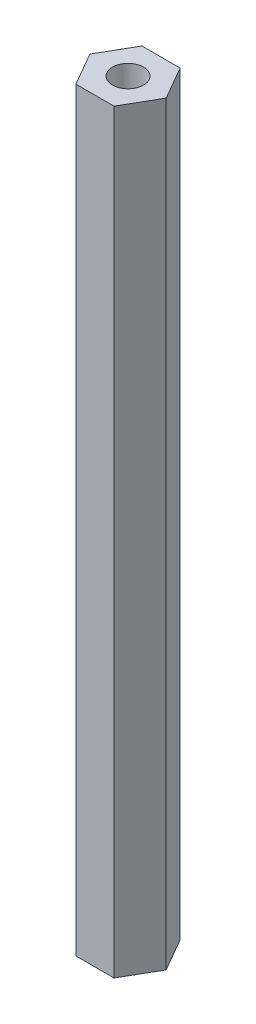
ISO-10303-21;
HEADER;
FILE_DESCRIPTION(('STEP AP214'),'2;1');
FILE_NAME('part.step','',(''),(''),'','','');
FILE_SCHEMA(('AUTOMOTIVE_DESIGN { 1 0 10303 214 1 1 1 1 }'));
ENDSEC;
DATA;
#1=APPLICATION_CONTEXT('core data for automotive mechanical design processes');
#2=APPLICATION_PROTOCOL_DEFINITION('international standard','automotive_design',2000,#1);
#3=PRODUCT_CONTEXT('',#1,'mechanical');
#4=PRODUCT('Part','Part','',(#3));
#5=PRODUCT_RELATED_PRODUCT_CATEGORY('part','',(#4));
#6=PRODUCT_DEFINITION_FORMATION('','',#4);
#7=PRODUCT_DEFINITION_CONTEXT('part definition',#1,'design');
#8=PRODUCT_DEFINITION('design','',#6,#7);
#9=PRODUCT_DEFINITION_SHAPE('','',#8);
#10=(LENGTH_UNIT() NAMED_UNIT(*) SI_UNIT(.MILLI.,.METRE.));
#11=(NAMED_UNIT(*) PLANE_ANGLE_UNIT() SI_UNIT($,.RADIAN.));
#12=(NAMED_UNIT(*) SI_UNIT($,.STERADIAN.) SOLID_ANGLE_UNIT());
#13=UNCERTAINTY_MEASURE_WITH_UNIT(LENGTH_MEASURE(1.E-05),#10,'distance_accuracy_value','');
#14=(GEOMETRIC_REPRESENTATION_CONTEXT(3) GLOBAL_UNCERTAINTY_ASSIGNED_CONTEXT((#13)) GLOBAL_UNIT_ASSIGNED_CONTEXT((#10,
#11,#12)) REPRESENTATION_CONTEXT('',''));
#15=CARTESIAN_POINT('',(0.,0.,0.));
#16=DIRECTION('',(0.,0.,1.));
#17=DIRECTION('',(1.,0.,0.));
#18=AXIS2_PLACEMENT_3D('',#15,#16,#17);
#19=CARTESIAN_POINT('',(2.02072594216368,40.,-3.50000000000001));
#20=DIRECTION('',(0.,0.,1.));
#21=DIRECTION('',(1.,0.,0.));
#22=AXIS2_PLACEMENT_3D('',#19,#20,#21);
#23=PLANE('',#22);
#24=DIRECTION('',(-1.,0.,0.));
#25=VECTOR('',#24,1.);
#26=CARTESIAN_POINT('',(2.02072594216368,-40.,-3.50000000000001));
#27=LINE('',#26,#25);
#28=CARTESIAN_POINT('',(2.02072594216368,-40.,-3.50000000000001));
#29=VERTEX_POINT('',#28);
#30=CARTESIAN_POINT('',(-2.0207259421637,-40.,-3.50000000000001));
#31=VERTEX_POINT('',#30);
#32=EDGE_CURVE('E144',#29,#31,#27,.T.);
#33=ORIENTED_EDGE('',*,*,#32,.T.);
#34=DIRECTION('',(0.,-1.,0.));
#35=VECTOR('',#34,1.);
#36=CARTESIAN_POINT('',(-2.0207259421637,40.,-3.50000000000001));
#37=LINE('',#36,#35);
#38=CARTESIAN_POINT('',(-2.0207259421637,40.,-3.50000000000001));
#39=VERTEX_POINT('',#38);
#40=EDGE_CURVE('E11',#39,#31,#37,.T.);
#41=ORIENTED_EDGE('',*,*,#40,.F.);
#42=DIRECTION('',(-1.,0.,0.));
#43=VECTOR('',#42,1.);
#44=CARTESIAN_POINT('',(2.02072594216368,40.,-3.50000000000001));
#45=LINE('',#44,#43);
#46=CARTESIAN_POINT('',(2.02072594216368,40.,-3.50000000000001));
#47=VERTEX_POINT('',#46);
#48=EDGE_CURVE('E165',#47,#39,#45,.T.);
#49=ORIENTED_EDGE('',*,*,#48,.F.);
#50=DIRECTION('',(0.,-1.,0.));
#51=VECTOR('',#50,1.);
#52=CARTESIAN_POINT('',(2.02072594216368,40.,-3.50000000000001));
#53=LINE('',#52,#51);
#54=EDGE_CURVE('E143',#47,#29,#53,.T.);
#55=ORIENTED_EDGE('',*,*,#54,.T.);
#56=EDGE_LOOP('',(#33,#41,#49,#55));
#57=FACE_BOUND('',#56,.T.);
#58=ADVANCED_FACE('F52',(#57),#23,.F.);
#59=CARTESIAN_POINT('',(-2.0207259421637,40.,-3.50000000000001));
#60=DIRECTION('',(0.866025403784439,0.,0.499999999999999));
#61=DIRECTION('',(0.499999999999999,0.,-0.866025403784439));
#62=AXIS2_PLACEMENT_3D('',#59,#60,#61);
#63=PLANE('',#62);
#64=DIRECTION('',(-0.499999999999999,0.,0.866025403784439));
#65=VECTOR('',#64,1.);
#66=CARTESIAN_POINT('',(-2.0207259421637,-40.,-3.50000000000001));
#67=LINE('',#66,#65);
#68=CARTESIAN_POINT('',(-4.04145188432738,-40.,0.));
#69=VERTEX_POINT('',#68);
#70=EDGE_CURVE('E149',#31,#69,#67,.T.);
#71=ORIENTED_EDGE('',*,*,#70,.T.);
#72=DIRECTION('',(0.,-1.,0.));
#73=VECTOR('',#72,1.);
#74=CARTESIAN_POINT('',(-4.04145188432738,40.,0.));
#75=LINE('',#74,#73);
#76=CARTESIAN_POINT('',(-4.04145188432738,40.,0.));
#77=VERTEX_POINT('',#76);
#78=EDGE_CURVE('E65',#77,#69,#75,.T.);
#79=ORIENTED_EDGE('',*,*,#78,.F.);
#80=DIRECTION('',(-0.499999999999999,0.,0.866025403784439));
#81=VECTOR('',#80,1.);
#82=CARTESIAN_POINT('',(-2.0207259421637,40.,-3.50000000000001));
#83=LINE('',#82,#81);
#84=EDGE_CURVE('E107',#39,#77,#83,.T.);
#85=ORIENTED_EDGE('',*,*,#84,.F.);
#86=ORIENTED_EDGE('',*,*,#40,.T.);
#87=EDGE_LOOP('',(#71,#79,#85,#86));
#88=FACE_BOUND('',#87,.T.);
#89=ADVANCED_FACE('F195',(#88),#63,.F.);
#90=CARTESIAN_POINT('',(-4.04145188432738,40.,0.));
#91=DIRECTION('',(0.866025403784439,0.,-0.499999999999999));
#92=DIRECTION('',(-0.499999999999999,0.,-0.866025403784439));
#93=AXIS2_PLACEMENT_3D('',#90,#91,#92);
#94=PLANE('',#93);
#95=DIRECTION('',(0.499999999999999,0.,0.866025403784439));
#96=VECTOR('',#95,1.);
#97=CARTESIAN_POINT('',(-4.04145188432738,-40.,0.));
#98=LINE('',#97,#96);
#99=CARTESIAN_POINT('',(-2.0207259421637,-40.,3.49999999999998));
#100=VERTEX_POINT('',#99);
#101=EDGE_CURVE('E153',#69,#100,#98,.T.);
#102=ORIENTED_EDGE('',*,*,#101,.T.);
#103=DIRECTION('',(0.,-1.,0.));
#104=VECTOR('',#103,1.);
#105=CARTESIAN_POINT('',(-2.0207259421637,40.,3.49999999999998));
#106=LINE('',#105,#104);
#107=CARTESIAN_POINT('',(-2.0207259421637,40.,3.49999999999998));
#108=VERTEX_POINT('',#107);
#109=EDGE_CURVE('E131',#108,#100,#106,.T.);
#110=ORIENTED_EDGE('',*,*,#109,.F.);
#111=DIRECTION('',(0.499999999999999,0.,0.866025403784439));
#112=VECTOR('',#111,1.);
#113=CARTESIAN_POINT('',(-4.04145188432738,40.,0.));
#114=LINE('',#113,#112);
#115=EDGE_CURVE('E121',#77,#108,#114,.T.);
#116=ORIENTED_EDGE('',*,*,#115,.F.);
#117=ORIENTED_EDGE('',*,*,#78,.T.);
#118=EDGE_LOOP('',(#102,#110,#116,#117));
#119=FACE_BOUND('',#118,.T.);
#120=ADVANCED_FACE('F175',(#119),#94,.F.);
#121=CARTESIAN_POINT('',(-2.0207259421637,40.,3.49999999999998));
#122=DIRECTION('',(0.,0.,-1.));
#123=DIRECTION('',(-1.,0.,0.));
#124=AXIS2_PLACEMENT_3D('',#121,#122,#123);
#125=PLANE('',#124);
#126=DIRECTION('',(1.,0.,0.));
#127=VECTOR('',#126,1.);
#128=CARTESIAN_POINT('',(-2.0207259421637,-40.,3.49999999999998));
#129=LINE('',#128,#127);
#130=CARTESIAN_POINT('',(2.02072594216368,-40.,3.49999999999998));
#131=VERTEX_POINT('',#130);
#132=EDGE_CURVE('E135',#100,#131,#129,.T.);
#133=ORIENTED_EDGE('',*,*,#132,.T.);
#134=DIRECTION('',(0.,-1.,0.));
#135=VECTOR('',#134,1.);
#136=CARTESIAN_POINT('',(2.02072594216368,40.,3.49999999999998));
#137=LINE('',#136,#135);
#138=CARTESIAN_POINT('',(2.02072594216368,40.,3.49999999999998));
#139=VERTEX_POINT('',#138);
#140=EDGE_CURVE('E129',#139,#131,#137,.T.);
#141=ORIENTED_EDGE('',*,*,#140,.F.);
#142=DIRECTION('',(1.,0.,0.));
#143=VECTOR('',#142,1.);
#144=CARTESIAN_POINT('',(-2.0207259421637,40.,3.49999999999998));
#145=LINE('',#144,#143);
#146=EDGE_CURVE('E120',#108,#139,#145,.T.);
#147=ORIENTED_EDGE('',*,*,#146,.F.);
#148=ORIENTED_EDGE('',*,*,#109,.T.);
#149=EDGE_LOOP('',(#133,#141,#147,#148));
#150=FACE_BOUND('',#149,.T.);
#151=ADVANCED_FACE('F128',(#150),#125,.F.);
#152=CARTESIAN_POINT('',(2.02072594216368,40.,3.49999999999998));
#153=DIRECTION('',(-0.866025403784438,0.,-0.500000000000001));
#154=DIRECTION('',(-0.500000000000001,0.,0.866025403784438));
#155=AXIS2_PLACEMENT_3D('',#152,#153,#154);
#156=PLANE('',#155);
#157=DIRECTION('',(0.500000000000001,0.,-0.866025403784438));
#158=VECTOR('',#157,1.);
#159=CARTESIAN_POINT('',(2.02072594216368,-40.,3.49999999999998));
#160=LINE('',#159,#158);
#161=CARTESIAN_POINT('',(4.04145188432737,-40.,0.));
#162=VERTEX_POINT('',#161);
#163=EDGE_CURVE('E94',#131,#162,#160,.T.);
#164=ORIENTED_EDGE('',*,*,#163,.T.);
#165=DIRECTION('',(0.,-1.,0.));
#166=VECTOR('',#165,1.);
#167=CARTESIAN_POINT('',(4.04145188432737,40.,0.));
#168=LINE('',#167,#166);
#169=CARTESIAN_POINT('',(4.04145188432737,40.,0.));
#170=VERTEX_POINT('',#169);
#171=EDGE_CURVE('E133',#170,#162,#168,.T.);
#172=ORIENTED_EDGE('',*,*,#171,.F.);
#173=DIRECTION('',(0.500000000000001,0.,-0.866025403784438));
#174=VECTOR('',#173,1.);
#175=CARTESIAN_POINT('',(2.02072594216368,40.,3.49999999999998));
#176=LINE('',#175,#174);
#177=EDGE_CURVE('E123',#139,#170,#176,.T.);
#178=ORIENTED_EDGE('',*,*,#177,.F.);
#179=ORIENTED_EDGE('',*,*,#140,.T.);
#180=EDGE_LOOP('',(#164,#172,#178,#179));
#181=FACE_BOUND('',#180,.T.);
#182=ADVANCED_FACE('F140',(#181),#156,.F.);
#183=CARTESIAN_POINT('',(4.04145188432737,40.,0.));
#184=DIRECTION('',(-0.866025403784439,0.,0.5));
#185=DIRECTION('',(0.5,0.,0.866025403784439));
#186=AXIS2_PLACEMENT_3D('',#183,#184,#185);
#187=PLANE('',#186);
#188=DIRECTION('',(-0.5,0.,-0.866025403784439));
#189=VECTOR('',#188,1.);
#190=CARTESIAN_POINT('',(4.04145188432737,-40.,0.));
#191=LINE('',#190,#189);
#192=EDGE_CURVE('E99',#162,#29,#191,.T.);
#193=ORIENTED_EDGE('',*,*,#192,.T.);
#194=ORIENTED_EDGE('',*,*,#54,.F.);
#195=DIRECTION('',(-0.5,0.,-0.866025403784439));
#196=VECTOR('',#195,1.);
#197=CARTESIAN_POINT('',(4.04145188432737,40.,0.));
#198=LINE('',#197,#196);
#199=EDGE_CURVE('E69',#170,#47,#198,.T.);
#200=ORIENTED_EDGE('',*,*,#199,.F.);
#201=ORIENTED_EDGE('',*,*,#171,.T.);
#202=EDGE_LOOP('',(#193,#194,#200,#201));
#203=FACE_BOUND('',#202,.T.);
#204=ADVANCED_FACE('F177',(#203),#187,.F.);
#205=CARTESIAN_POINT('',(0.,40.,0.));
#206=DIRECTION('',(0.,1.,0.));
#207=DIRECTION('',(0.,0.,1.));
#208=AXIS2_PLACEMENT_3D('',#205,#206,#207);
#209=PLANE('',#208);
#210=CARTESIAN_POINT('',(0.,40.,0.));
#211=DIRECTION('',(0.,1.,0.));
#212=DIRECTION('',(0.,0.,1.));
#213=AXIS2_PLACEMENT_3D('',#210,#211,#212);
#214=CIRCLE('',#213,1.64999999999999);
#215=CARTESIAN_POINT('',(0.,40.,1.64999999999999));
#216=VERTEX_POINT('',#215);
#217=EDGE_CURVE('E308',#216,#216,#214,.T.);
#218=ORIENTED_EDGE('',*,*,#217,.F.);
#219=EDGE_LOOP('',(#218));
#220=FACE_BOUND('',#219,.T.);
#221=ORIENTED_EDGE('',*,*,#48,.T.);
#222=ORIENTED_EDGE('',*,*,#84,.T.);
#223=ORIENTED_EDGE('',*,*,#115,.T.);
#224=ORIENTED_EDGE('',*,*,#146,.T.);
#225=ORIENTED_EDGE('',*,*,#177,.T.);
#226=ORIENTED_EDGE('',*,*,#199,.T.);
#227=EDGE_LOOP('',(#221,#222,#223,#224,#225,#226));
#228=FACE_BOUND('',#227,.T.);
#229=ADVANCED_FACE('F116',(#220,#228),#209,.T.);
#230=CARTESIAN_POINT('',(0.,-40.,0.));
#231=DIRECTION('',(0.,1.,0.));
#232=DIRECTION('',(0.,0.,1.));
#233=AXIS2_PLACEMENT_3D('',#230,#231,#232);
#234=PLANE('',#233);
#235=CARTESIAN_POINT('',(0.,-40.,0.));
#236=DIRECTION('',(0.,-1.,0.));
#237=DIRECTION('',(0.,0.,-1.));
#238=AXIS2_PLACEMENT_3D('',#235,#236,#237);
#239=CIRCLE('',#238,1.64999999999999);
#240=CARTESIAN_POINT('',(0.,-40.,-1.64999999999999));
#241=VERTEX_POINT('',#240);
#242=EDGE_CURVE('E305',#241,#241,#239,.T.);
#243=ORIENTED_EDGE('',*,*,#242,.F.);
#244=EDGE_LOOP('',(#243));
#245=FACE_BOUND('',#244,.T.);
#246=ORIENTED_EDGE('',*,*,#32,.F.);
#247=ORIENTED_EDGE('',*,*,#192,.F.);
#248=ORIENTED_EDGE('',*,*,#163,.F.);
#249=ORIENTED_EDGE('',*,*,#132,.F.);
#250=ORIENTED_EDGE('',*,*,#101,.F.);
#251=ORIENTED_EDGE('',*,*,#70,.F.);
#252=EDGE_LOOP('',(#246,#247,#248,#249,#250,#251));
#253=FACE_BOUND('',#252,.T.);
#254=ADVANCED_FACE('F173',(#245,#253),#234,.F.);
#255=CARTESIAN_POINT('',(0.,27.5,0.));
#256=DIRECTION('',(0.,1.,0.));
#257=DIRECTION('',(0.,0.,1.));
#258=AXIS2_PLACEMENT_3D('',#255,#256,#257);
#259=CONICAL_SURFACE('',#258,1.65,1.02974425867665);
#260=CARTESIAN_POINT('',(0.,26.5085799786045,0.));
#261=VERTEX_POINT('',#260);
#262=VERTEX_LOOP('',#261);
#263=FACE_BOUND('',#262,.T.);
#264=CARTESIAN_POINT('',(0.,27.5,0.));
#265=DIRECTION('',(0.,1.,0.));
#266=DIRECTION('',(0.,0.,1.));
#267=AXIS2_PLACEMENT_3D('',#264,#265,#266);
#268=CIRCLE('',#267,1.65);
#269=CARTESIAN_POINT('',(0.,27.5,1.65));
#270=VERTEX_POINT('',#269);
#271=EDGE_CURVE('E147',#270,#270,#268,.T.);
#272=ORIENTED_EDGE('',*,*,#271,.T.);
#273=EDGE_LOOP('',(#272));
#274=FACE_BOUND('',#273,.T.);
#275=ADVANCED_FACE('F232',(#263,#274),#259,.F.);
#276=CARTESIAN_POINT('',(0.,40.,0.));
#277=DIRECTION('',(0.,1.,0.));
#278=DIRECTION('',(0.,0.,1.));
#279=AXIS2_PLACEMENT_3D('',#276,#277,#278);
#280=CYLINDRICAL_SURFACE('',#279,1.64999999999999);
#281=ORIENTED_EDGE('',*,*,#271,.F.);
#282=EDGE_LOOP('',(#281));
#283=FACE_BOUND('',#282,.T.);
#284=ORIENTED_EDGE('',*,*,#217,.T.);
#285=EDGE_LOOP('',(#284));
#286=FACE_BOUND('',#285,.T.);
#287=ADVANCED_FACE('F248',(#283,#286),#280,.F.);
#288=CARTESIAN_POINT('',(0.,-27.5,0.));
#289=DIRECTION('',(0.,-1.,0.));
#290=DIRECTION('',(0.,0.,-1.));
#291=AXIS2_PLACEMENT_3D('',#288,#289,#290);
#292=CONICAL_SURFACE('',#291,1.65,1.02974425867665);
#293=CARTESIAN_POINT('',(0.,-26.5085799786045,0.));
#294=VERTEX_POINT('',#293);
#295=VERTEX_LOOP('',#294);
#296=FACE_BOUND('',#295,.T.);
#297=CARTESIAN_POINT('',(0.,-27.5,0.));
#298=DIRECTION('',(0.,-1.,0.));
#299=DIRECTION('',(0.,0.,-1.));
#300=AXIS2_PLACEMENT_3D('',#297,#298,#299);
#301=CIRCLE('',#300,1.65);
#302=CARTESIAN_POINT('',(0.,-27.5,-1.65));
#303=VERTEX_POINT('',#302);
#304=EDGE_CURVE('E296',#303,#303,#301,.T.);
#305=ORIENTED_EDGE('',*,*,#304,.T.);
#306=EDGE_LOOP('',(#305));
#307=FACE_BOUND('',#306,.T.);
#308=ADVANCED_FACE('F258',(#296,#307),#292,.F.);
#309=CARTESIAN_POINT('',(0.,-40.,0.));
#310=DIRECTION('',(0.,-1.,0.));
#311=DIRECTION('',(0.,0.,-1.));
#312=AXIS2_PLACEMENT_3D('',#309,#310,#311);
#313=CYLINDRICAL_SURFACE('',#312,1.64999999999999);
#314=ORIENTED_EDGE('',*,*,#304,.F.);
#315=EDGE_LOOP('',(#314));
#316=FACE_BOUND('',#315,.T.);
#317=ORIENTED_EDGE('',*,*,#242,.T.);
#318=EDGE_LOOP('',(#317));
#319=FACE_BOUND('',#318,.T.);
#320=ADVANCED_FACE('F266',(#316,#319),#313,.F.);
#321=CLOSED_SHELL('',(#58,#89,#120,#151,#182,#204,#229,#254,#275,#287,#308,#320));
#322=MANIFOLD_SOLID_BREP('B2',#321);
#323=ADVANCED_BREP_SHAPE_REPRESENTATION('',(#18,#322),#14);
#324=SHAPE_DEFINITION_REPRESENTATION(#9,#323);
ENDSEC;
END-ISO-10303-21;
